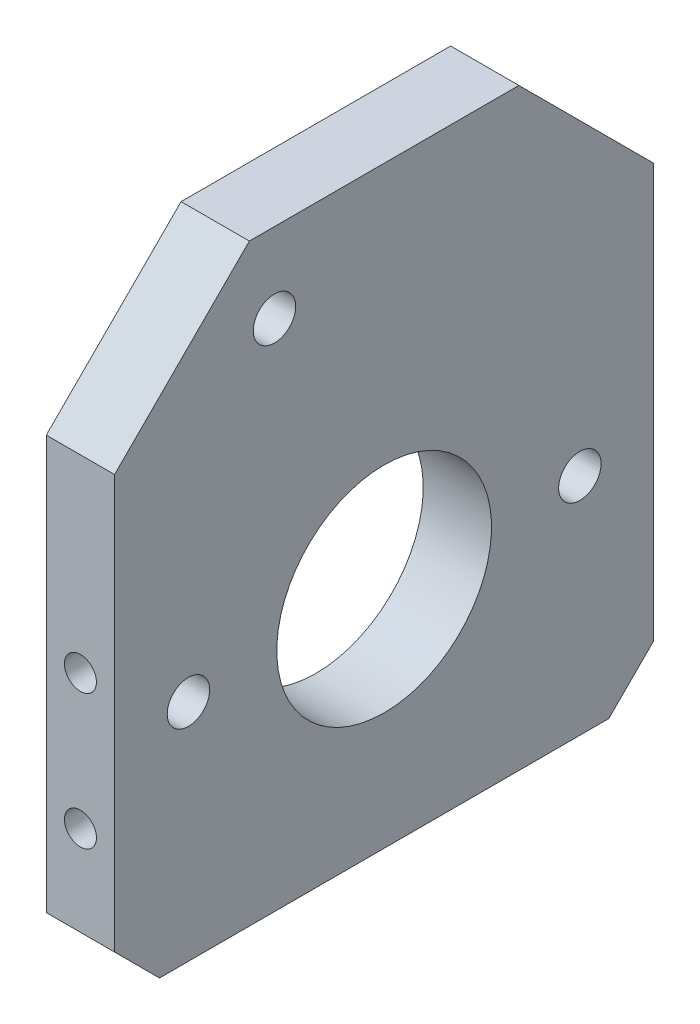
ISO-10303-21;
HEADER;
FILE_DESCRIPTION(('STEP AP214'),'2;1');
FILE_NAME('part.step','',(''),(''),'','','');
FILE_SCHEMA(('AUTOMOTIVE_DESIGN { 1 0 10303 214 1 1 1 1 }'));
ENDSEC;
DATA;
#1=APPLICATION_CONTEXT('core data for automotive mechanical design processes');
#2=APPLICATION_PROTOCOL_DEFINITION('international standard','automotive_design',2000,#1);
#3=PRODUCT_CONTEXT('',#1,'mechanical');
#4=PRODUCT('Part','Part','',(#3));
#5=PRODUCT_RELATED_PRODUCT_CATEGORY('part','',(#4));
#6=PRODUCT_DEFINITION_FORMATION('','',#4);
#7=PRODUCT_DEFINITION_CONTEXT('part definition',#1,'design');
#8=PRODUCT_DEFINITION('design','',#6,#7);
#9=PRODUCT_DEFINITION_SHAPE('','',#8);
#10=(LENGTH_UNIT() NAMED_UNIT(*) SI_UNIT(.MILLI.,.METRE.));
#11=(NAMED_UNIT(*) PLANE_ANGLE_UNIT() SI_UNIT($,.RADIAN.));
#12=(NAMED_UNIT(*) SI_UNIT($,.STERADIAN.) SOLID_ANGLE_UNIT());
#13=UNCERTAINTY_MEASURE_WITH_UNIT(LENGTH_MEASURE(1.E-05),#10,'distance_accuracy_value','');
#14=(GEOMETRIC_REPRESENTATION_CONTEXT(3) GLOBAL_UNCERTAINTY_ASSIGNED_CONTEXT((#13)) GLOBAL_UNIT_ASSIGNED_CONTEXT((#10,
#11,#12)) REPRESENTATION_CONTEXT('',''));
#15=CARTESIAN_POINT('',(0.,0.,0.));
#16=DIRECTION('',(0.,0.,1.));
#17=DIRECTION('',(1.,0.,0.));
#18=AXIS2_PLACEMENT_3D('',#15,#16,#17);
#19=CARTESIAN_POINT('',(4.826,0.,0.));
#20=DIRECTION('',(1.,0.,0.));
#21=DIRECTION('',(0.,1.,0.));
#22=AXIS2_PLACEMENT_3D('',#19,#20,#21);
#23=PLANE('',#22);
#24=CARTESIAN_POINT('',(4.82600000000078,24.6557401750094,3.49708995956852));
#25=DIRECTION('',(-1.,0.,0.));
#26=DIRECTION('',(0.,0.,1.));
#27=AXIS2_PLACEMENT_3D('',#24,#25,#26);
#28=CIRCLE('',#27,1.5);
#29=CARTESIAN_POINT('',(4.82600000000079,24.6557401750094,4.99708995956851));
#30=VERTEX_POINT('',#29);
#31=EDGE_CURVE('E191',#30,#30,#28,.T.);
#32=ORIENTED_EDGE('',*,*,#31,.T.);
#33=EDGE_LOOP('',(#32));
#34=FACE_BOUND('',#33,.T.);
#35=CARTESIAN_POINT('',(4.82600000000113,4.2323464163506,9.57640664550778));
#36=DIRECTION('',(-1.,0.,0.));
#37=DIRECTION('',(0.,0.,1.));
#38=AXIS2_PLACEMENT_3D('',#35,#36,#37);
#39=CIRCLE('',#38,1.5);
#40=CARTESIAN_POINT('',(4.82600000000114,4.2323464163506,11.0764066455078));
#41=VERTEX_POINT('',#40);
#42=EDGE_CURVE('E198',#41,#41,#39,.T.);
#43=ORIENTED_EDGE('',*,*,#42,.T.);
#44=EDGE_LOOP('',(#43));
#45=FACE_BOUND('',#44,.T.);
#46=CARTESIAN_POINT('',(4.82600000000084,4.2323464163506,-18.0822267263709));
#47=DIRECTION('',(-1.,0.,0.));
#48=DIRECTION('',(0.,0.,1.));
#49=AXIS2_PLACEMENT_3D('',#46,#47,#48);
#50=CIRCLE('',#49,1.5);
#51=CARTESIAN_POINT('',(4.82600000000085,4.2323464163506,-16.5822267263709));
#52=VERTEX_POINT('',#51);
#53=EDGE_CURVE('E206',#52,#52,#50,.T.);
#54=ORIENTED_EDGE('',*,*,#53,.T.);
#55=EDGE_LOOP('',(#54));
#56=FACE_BOUND('',#55,.T.);
#57=DIRECTION('',(0.,-1.,0.));
#58=VECTOR('',#57,1.);
#59=CARTESIAN_POINT('',(4.82599999999973,30.2823464163507,14.7970899595685));
#60=LINE('',#59,#58);
#61=CARTESIAN_POINT('',(4.82599999999986,20.7573464163507,14.7970899595685));
#62=VERTEX_POINT('',#61);
#63=CARTESIAN_POINT('',(4.82600000000027,-8.46765358364934,14.7970899595684));
#64=VERTEX_POINT('',#63);
#65=EDGE_CURVE('E219',#62,#64,#60,.T.);
#66=ORIENTED_EDGE('',*,*,#65,.T.);
#67=DIRECTION('',(0.,0.70710678118655,0.707106781186545));
#68=VECTOR('',#67,1.);
#69=CARTESIAN_POINT('',(4.82600000000028,-11.6323717716089,11.632371771609));
#70=LINE('',#69,#68);
#71=CARTESIAN_POINT('',(4.82600000000028,-11.6426535836494,11.6220899595684));
#72=VERTEX_POINT('',#71);
#73=EDGE_CURVE('E54',#64,#72,#70,.F.);
#74=ORIENTED_EDGE('',*,*,#73,.T.);
#75=DIRECTION('',(0.,0.,-1.));
#76=VECTOR('',#75,1.);
#77=CARTESIAN_POINT('',(4.82600000000032,-11.6426535836494,14.7970899595684));
#78=LINE('',#77,#76);
#79=CARTESIAN_POINT('',(4.82599999999995,-11.6426535836494,-20.1279100404315));
#80=VERTEX_POINT('',#79);
#81=EDGE_CURVE('E222',#72,#80,#78,.T.);
#82=ORIENTED_EDGE('',*,*,#81,.T.);
#83=DIRECTION('',(0.,-0.707106781186546,0.707106781186549));
#84=VECTOR('',#83,1.);
#85=CARTESIAN_POINT('',(4.82600000000005,-15.8852818120404,-15.8852818120405));
#86=LINE('',#85,#84);
#87=CARTESIAN_POINT('',(4.82599999999987,-8.46765358364935,-23.3029100404316));
#88=VERTEX_POINT('',#87);
#89=EDGE_CURVE('E64',#80,#88,#86,.F.);
#90=ORIENTED_EDGE('',*,*,#89,.T.);
#91=DIRECTION('',(0.,1.,0.));
#92=VECTOR('',#91,1.);
#93=CARTESIAN_POINT('',(4.82599999999933,30.2823464163507,-23.3029100404315));
#94=LINE('',#93,#92);
#95=CARTESIAN_POINT('',(4.82599999999946,20.7573464163506,-23.3029100404315));
#96=VERTEX_POINT('',#95);
#97=EDGE_CURVE('E225',#88,#96,#94,.T.);
#98=ORIENTED_EDGE('',*,*,#97,.T.);
#99=DIRECTION('',(0.,-0.707106781186549,-0.707106781186546));
#100=VECTOR('',#99,1.);
#101=CARTESIAN_POINT('',(4.82599999999946,22.0301282283911,-22.0301282283911));
#102=LINE('',#101,#100);
#103=CARTESIAN_POINT('',(4.82599999999943,30.2823464163507,-13.7779100404315));
#104=VERTEX_POINT('',#103);
#105=EDGE_CURVE('E265',#96,#104,#102,.F.);
#106=ORIENTED_EDGE('',*,*,#105,.T.);
#107=DIRECTION('',(0.,0.,1.));
#108=VECTOR('',#107,1.);
#109=CARTESIAN_POINT('',(4.82599999999973,30.2823464163507,14.7970899595685));
#110=LINE('',#109,#108);
#111=CARTESIAN_POINT('',(4.82599999999963,30.2823464163507,5.27208995956843));
#112=VERTEX_POINT('',#111);
#113=EDGE_CURVE('E228',#104,#112,#110,.T.);
#114=ORIENTED_EDGE('',*,*,#113,.T.);
#115=DIRECTION('',(0.,0.707106781186546,-0.707106781186549));
#116=VECTOR('',#115,1.);
#117=CARTESIAN_POINT('',(4.82599999999994,17.7772181879597,17.7772181879595));
#118=LINE('',#117,#116);
#119=EDGE_CURVE('E262',#112,#62,#118,.F.);
#120=ORIENTED_EDGE('',*,*,#119,.T.);
#121=EDGE_LOOP('',(#66,#74,#82,#90,#98,#106,#114,#120));
#122=FACE_BOUND('',#121,.T.);
#123=CARTESIAN_POINT('',(4.8259999999999,4.23234641635067,-4.25291004043155));
#124=DIRECTION('',(1.,0.,0.));
#125=DIRECTION('',(0.,1.,0.));
#126=AXIS2_PLACEMENT_3D('',#123,#124,#125);
#127=CIRCLE('',#126,7.5875);
#128=CARTESIAN_POINT('',(4.82599999999979,11.8198464163507,-4.25291004043155));
#129=VERTEX_POINT('',#128);
#130=EDGE_CURVE('E211',#129,#129,#127,.T.);
#131=ORIENTED_EDGE('',*,*,#130,.F.);
#132=EDGE_LOOP('',(#131));
#133=FACE_BOUND('',#132,.T.);
#134=ADVANCED_FACE('F45',(#34,#45,#56,#122,#133),#23,.T.);
#135=CARTESIAN_POINT('',(0.,0.,0.));
#136=DIRECTION('',(1.,0.,0.));
#137=DIRECTION('',(0.,1.,0.));
#138=AXIS2_PLACEMENT_3D('',#135,#136,#137);
#139=PLANE('',#138);
#140=CARTESIAN_POINT('',(-3.07587689183458E-13,24.6557401750094,3.49708995956857));
#141=DIRECTION('',(-1.,0.,0.));
#142=DIRECTION('',(0.,0.,1.));
#143=AXIS2_PLACEMENT_3D('',#140,#141,#142);
#144=CIRCLE('',#143,1.5);
#145=CARTESIAN_POINT('',(-2.91876023158664E-13,24.6557401750094,4.99708995956857));
#146=VERTEX_POINT('',#145);
#147=EDGE_CURVE('E187',#146,#146,#144,.T.);
#148=ORIENTED_EDGE('',*,*,#147,.F.);
#149=EDGE_LOOP('',(#148));
#150=FACE_BOUND('',#149,.T.);
#151=CARTESIAN_POINT('',(0.,4.2323464163506,9.57640664550783));
#152=DIRECTION('',(-1.,0.,0.));
#153=DIRECTION('',(0.,0.,1.));
#154=AXIS2_PLACEMENT_3D('',#151,#152,#153);
#155=CIRCLE('',#154,1.5);
#156=CARTESIAN_POINT('',(0.,4.2323464163506,11.0764066455078));
#157=VERTEX_POINT('',#156);
#158=EDGE_CURVE('E195',#157,#157,#155,.T.);
#159=ORIENTED_EDGE('',*,*,#158,.F.);
#160=EDGE_LOOP('',(#159));
#161=FACE_BOUND('',#160,.T.);
#162=CARTESIAN_POINT('',(-2.48387440988479E-13,4.2323464163506,-18.0822267263708));
#163=DIRECTION('',(-1.,0.,0.));
#164=DIRECTION('',(0.,0.,1.));
#165=AXIS2_PLACEMENT_3D('',#162,#163,#164);
#166=CIRCLE('',#165,1.5);
#167=CARTESIAN_POINT('',(-2.32675774963685E-13,4.2323464163506,-16.5822267263708));
#168=VERTEX_POINT('',#167);
#169=EDGE_CURVE('E202',#168,#168,#166,.T.);
#170=ORIENTED_EDGE('',*,*,#169,.F.);
#171=EDGE_LOOP('',(#170));
#172=FACE_BOUND('',#171,.T.);
#173=DIRECTION('',(0.,0.,-1.));
#174=VECTOR('',#173,1.);
#175=CARTESIAN_POINT('',(3.17591721276758E-13,-11.6426535836494,14.7970899595685));
#176=LINE('',#175,#174);
#177=CARTESIAN_POINT('',(2.84335361524277E-13,-11.6426535836494,11.6220899595685));
#178=VERTEX_POINT('',#177);
#179=CARTESIAN_POINT('',(0.,-11.6426535836494,-20.1279100404315));
#180=VERTEX_POINT('',#179);
#181=EDGE_CURVE('E235',#178,#180,#176,.T.);
#182=ORIENTED_EDGE('',*,*,#181,.F.);
#183=DIRECTION('',(0.,-0.70710678118655,-0.707106781186545));
#184=VECTOR('',#183,1.);
#185=CARTESIAN_POINT('',(2.83627288322208E-13,-11.6426535836494,11.6220899595685));
#186=LINE('',#185,#184);
#187=CARTESIAN_POINT('',(2.7324990827345E-13,-8.4676535836494,14.7970899595685));
#188=VERTEX_POINT('',#187);
#189=EDGE_CURVE('E282',#178,#188,#186,.F.);
#190=ORIENTED_EDGE('',*,*,#189,.T.);
#191=DIRECTION('',(0.,-1.,0.));
#192=VECTOR('',#191,1.);
#193=CARTESIAN_POINT('',(-2.67929699247236E-13,30.2823464163506,14.7970899595685));
#194=LINE('',#193,#192);
#195=CARTESIAN_POINT('',(-1.34904260237313E-13,20.7573464163506,14.7970899595685));
#196=VERTEX_POINT('',#195);
#197=EDGE_CURVE('E215',#196,#188,#194,.T.);
#198=ORIENTED_EDGE('',*,*,#197,.F.);
#199=DIRECTION('',(0.,-0.707106781186546,0.707106781186549));
#200=VECTOR('',#199,1.);
#201=CARTESIAN_POINT('',(-1.34441069388203E-13,20.7573464163506,14.7970899595685));
#202=LINE('',#201,#200);
#203=CARTESIAN_POINT('',(-3.67698778504679E-13,30.2823464163506,5.27208995956848));
#204=VERTEX_POINT('',#203);
#205=EDGE_CURVE('E251',#196,#204,#202,.F.);
#206=ORIENTED_EDGE('',*,*,#205,.T.);
#207=DIRECTION('',(0.,0.,1.));
#208=VECTOR('',#207,1.);
#209=CARTESIAN_POINT('',(-2.67929699247236E-13,30.2823464163506,14.7970899595685));
#210=LINE('',#209,#208);
#211=CARTESIAN_POINT('',(-5.67236937019564E-13,30.2823464163506,-13.7779100404315));
#212=VERTEX_POINT('',#211);
#213=EDGE_CURVE('E223',#212,#204,#210,.T.);
#214=ORIENTED_EDGE('',*,*,#213,.F.);
#215=DIRECTION('',(0.,0.707106781186549,0.707106781186546));
#216=VECTOR('',#215,1.);
#217=CARTESIAN_POINT('',(-5.67254576644416E-13,30.2823464163506,-13.7779100404315));
#218=LINE('',#217,#216);
#219=CARTESIAN_POINT('',(-5.33980577267082E-13,20.7573464163506,-23.3029100404315));
#220=VERTEX_POINT('',#219);
#221=EDGE_CURVE('E254',#212,#220,#218,.F.);
#222=ORIENTED_EDGE('',*,*,#221,.T.);
#223=DIRECTION('',(0.,1.,0.));
#224=VECTOR('',#223,1.);
#225=CARTESIAN_POINT('',(-6.67006016277006E-13,30.2823464163506,-23.3029100404315));
#226=LINE('',#225,#224);
#227=CARTESIAN_POINT('',(-1.2582640875632E-13,-8.46765358364942,-23.3029100404315));
#228=VERTEX_POINT('',#227);
#229=EDGE_CURVE('E239',#228,#220,#226,.T.);
#230=ORIENTED_EDGE('',*,*,#229,.F.);
#231=DIRECTION('',(0.,0.707106781186546,-0.707106781186549));
#232=VECTOR('',#231,1.);
#233=CARTESIAN_POINT('',(-1.25767452008319E-13,-8.46765358364942,-23.3029100404315));
#234=LINE('',#233,#232);
#235=EDGE_CURVE('E279',#228,#180,#234,.F.);
#236=ORIENTED_EDGE('',*,*,#235,.T.);
#237=EDGE_LOOP('',(#182,#190,#198,#206,#214,#222,#230,#236));
#238=FACE_BOUND('',#237,.T.);
#239=CARTESIAN_POINT('',(-1.03655502254666E-13,4.2323464163506,-4.2529100404315));
#240=DIRECTION('',(1.,0.,0.));
#241=DIRECTION('',(0.,1.,0.));
#242=AXIS2_PLACEMENT_3D('',#239,#240,#241);
#243=CIRCLE('',#242,7.5875);
#244=CARTESIAN_POINT('',(-2.09621960888556E-13,11.8198464163506,-4.2529100404315));
#245=VERTEX_POINT('',#244);
#246=EDGE_CURVE('E210',#245,#245,#243,.T.);
#247=ORIENTED_EDGE('',*,*,#246,.T.);
#248=EDGE_LOOP('',(#247));
#249=FACE_BOUND('',#248,.T.);
#250=ADVANCED_FACE('F301',(#150,#161,#172,#238,#249),#139,.F.);
#251=CARTESIAN_POINT('',(4.82599999999973,30.2823464163507,14.7970899595685));
#252=DIRECTION('',(0.,0.,-1.));
#253=DIRECTION('',(-1.,0.,0.));
#254=AXIS2_PLACEMENT_3D('',#251,#252,#253);
#255=PLANE('',#254);
#256=CARTESIAN_POINT('',(2.41299999999956,-2.1176535836495,14.7970899595685));
#257=DIRECTION('',(0.,0.,1.));
#258=DIRECTION('',(1.,0.,0.));
#259=AXIS2_PLACEMENT_3D('',#256,#257,#258);
#260=CIRCLE('',#259,1.1303);
#261=CARTESIAN_POINT('',(3.54329999999956,-2.1176535836495,14.7970899595685));
#262=VERTEX_POINT('',#261);
#263=EDGE_CURVE('E156',#262,#262,#260,.T.);
#264=ORIENTED_EDGE('',*,*,#263,.F.);
#265=EDGE_LOOP('',(#264));
#266=FACE_BOUND('',#265,.T.);
#267=CARTESIAN_POINT('',(2.41300000000005,7.4073464163505,14.7970899595685));
#268=DIRECTION('',(0.,0.,1.));
#269=DIRECTION('',(1.,0.,0.));
#270=AXIS2_PLACEMENT_3D('',#267,#268,#269);
#271=CIRCLE('',#270,1.1303);
#272=CARTESIAN_POINT('',(3.54330000000005,7.4073464163505,14.7970899595685));
#273=VERTEX_POINT('',#272);
#274=EDGE_CURVE('E155',#273,#273,#271,.T.);
#275=ORIENTED_EDGE('',*,*,#274,.F.);
#276=EDGE_LOOP('',(#275));
#277=FACE_BOUND('',#276,.T.);
#278=ORIENTED_EDGE('',*,*,#197,.T.);
#279=DIRECTION('',(1.,0.,0.));
#280=VECTOR('',#279,1.);
#281=CARTESIAN_POINT('',(4.82600000000027,-8.46765358364934,14.7970899595684));
#282=LINE('',#281,#280);
#283=EDGE_CURVE('E75',#188,#64,#282,.T.);
#284=ORIENTED_EDGE('',*,*,#283,.T.);
#285=ORIENTED_EDGE('',*,*,#65,.F.);
#286=DIRECTION('',(-1.,0.,0.));
#287=VECTOR('',#286,1.);
#288=CARTESIAN_POINT('',(4.82599999999986,20.7573464163507,14.7970899595685));
#289=LINE('',#288,#287);
#290=EDGE_CURVE('E268',#62,#196,#289,.T.);
#291=ORIENTED_EDGE('',*,*,#290,.T.);
#292=EDGE_LOOP('',(#278,#284,#285,#291));
#293=FACE_BOUND('',#292,.T.);
#294=ADVANCED_FACE('F303',(#266,#277,#293),#255,.F.);
#295=CARTESIAN_POINT('',(4.82600000000032,-11.6426535836494,14.7970899595684));
#296=DIRECTION('',(0.,1.,0.));
#297=DIRECTION('',(-1.,0.,0.));
#298=AXIS2_PLACEMENT_3D('',#295,#296,#297);
#299=PLANE('',#298);
#300=ORIENTED_EDGE('',*,*,#81,.F.);
#301=DIRECTION('',(-1.,0.,0.));
#302=VECTOR('',#301,1.);
#303=CARTESIAN_POINT('',(4.82600000000028,-11.6426535836494,11.6220899595684));
#304=LINE('',#303,#302);
#305=EDGE_CURVE('E275',#72,#178,#304,.T.);
#306=ORIENTED_EDGE('',*,*,#305,.T.);
#307=ORIENTED_EDGE('',*,*,#181,.T.);
#308=DIRECTION('',(1.,0.,0.));
#309=VECTOR('',#308,1.);
#310=CARTESIAN_POINT('',(4.82599999999995,-11.6426535836494,-20.1279100404315));
#311=LINE('',#310,#309);
#312=EDGE_CURVE('E272',#180,#80,#311,.T.);
#313=ORIENTED_EDGE('',*,*,#312,.T.);
#314=EDGE_LOOP('',(#300,#306,#307,#313));
#315=FACE_BOUND('',#314,.T.);
#316=ADVANCED_FACE('F295',(#315),#299,.F.);
#317=CARTESIAN_POINT('',(4.82599999999933,30.2823464163507,-23.3029100404315));
#318=DIRECTION('',(0.,0.,1.));
#319=DIRECTION('',(1.,0.,0.));
#320=AXIS2_PLACEMENT_3D('',#317,#318,#319);
#321=PLANE('',#320);
#322=CARTESIAN_POINT('',(2.41299999999947,7.4073464163505,-23.3029100404315));
#323=DIRECTION('',(0.,0.,-1.));
#324=DIRECTION('',(0.,1.,0.));
#325=AXIS2_PLACEMENT_3D('',#322,#323,#324);
#326=CIRCLE('',#325,1.1303);
#327=CARTESIAN_POINT('',(2.41299999999947,8.5376464163505,-23.3029100404315));
#328=VERTEX_POINT('',#327);
#329=EDGE_CURVE('E171',#328,#328,#326,.T.);
#330=ORIENTED_EDGE('',*,*,#329,.F.);
#331=EDGE_LOOP('',(#330));
#332=FACE_BOUND('',#331,.T.);
#333=CARTESIAN_POINT('',(2.41299999999947,-2.11765358364949,-23.3029100404315));
#334=DIRECTION('',(0.,0.,-1.));
#335=DIRECTION('',(0.,1.,0.));
#336=AXIS2_PLACEMENT_3D('',#333,#334,#335);
#337=CIRCLE('',#336,1.1303);
#338=CARTESIAN_POINT('',(2.41299999999947,-0.987353583649495,-23.3029100404315));
#339=VERTEX_POINT('',#338);
#340=EDGE_CURVE('E179',#339,#339,#337,.T.);
#341=ORIENTED_EDGE('',*,*,#340,.F.);
#342=EDGE_LOOP('',(#341));
#343=FACE_BOUND('',#342,.T.);
#344=ORIENTED_EDGE('',*,*,#97,.F.);
#345=DIRECTION('',(-1.,0.,0.));
#346=VECTOR('',#345,1.);
#347=CARTESIAN_POINT('',(4.82599999999987,-8.46765358364935,-23.3029100404316));
#348=LINE('',#347,#346);
#349=EDGE_CURVE('E11',#88,#228,#348,.T.);
#350=ORIENTED_EDGE('',*,*,#349,.T.);
#351=ORIENTED_EDGE('',*,*,#229,.T.);
#352=DIRECTION('',(1.,0.,0.));
#353=VECTOR('',#352,1.);
#354=CARTESIAN_POINT('',(4.82599999999946,20.7573464163506,-23.3029100404315));
#355=LINE('',#354,#353);
#356=EDGE_CURVE('E258',#220,#96,#355,.T.);
#357=ORIENTED_EDGE('',*,*,#356,.T.);
#358=EDGE_LOOP('',(#344,#350,#351,#357));
#359=FACE_BOUND('',#358,.T.);
#360=ADVANCED_FACE('F320',(#332,#343,#359),#321,.F.);
#361=CARTESIAN_POINT('',(4.82599999999973,30.2823464163507,14.7970899595685));
#362=DIRECTION('',(0.,-1.,0.));
#363=DIRECTION('',(1.,0.,0.));
#364=AXIS2_PLACEMENT_3D('',#361,#362,#363);
#365=PLANE('',#364);
#366=ORIENTED_EDGE('',*,*,#113,.F.);
#367=DIRECTION('',(-1.,0.,0.));
#368=VECTOR('',#367,1.);
#369=CARTESIAN_POINT('',(4.82599999999943,30.2823464163507,-13.7779100404316));
#370=LINE('',#369,#368);
#371=EDGE_CURVE('E247',#104,#212,#370,.T.);
#372=ORIENTED_EDGE('',*,*,#371,.T.);
#373=ORIENTED_EDGE('',*,*,#213,.T.);
#374=DIRECTION('',(1.,0.,0.));
#375=VECTOR('',#374,1.);
#376=CARTESIAN_POINT('',(4.82599999999963,30.2823464163507,5.27208995956843));
#377=LINE('',#376,#375);
#378=EDGE_CURVE('E232',#204,#112,#377,.T.);
#379=ORIENTED_EDGE('',*,*,#378,.T.);
#380=EDGE_LOOP('',(#366,#372,#373,#379));
#381=FACE_BOUND('',#380,.T.);
#382=ADVANCED_FACE('F312',(#381),#365,.F.);
#383=CARTESIAN_POINT('',(4.8259999999999,4.23234641635067,-4.25291004043155));
#384=DIRECTION('',(-1.,0.,0.));
#385=DIRECTION('',(0.,-1.,0.));
#386=AXIS2_PLACEMENT_3D('',#383,#384,#385);
#387=CYLINDRICAL_SURFACE('',#386,7.5875);
#388=ORIENTED_EDGE('',*,*,#130,.T.);
#389=EDGE_LOOP('',(#388));
#390=FACE_BOUND('',#389,.T.);
#391=ORIENTED_EDGE('',*,*,#246,.F.);
#392=EDGE_LOOP('',(#391));
#393=FACE_BOUND('',#392,.T.);
#394=ADVANCED_FACE('F343',(#390,#393),#387,.F.);
#395=CARTESIAN_POINT('',(-2.48509905668394E-13,4.2323464163506,-18.0822267263708));
#396=DIRECTION('',(-1.,0.,0.));
#397=DIRECTION('',(0.,0.,1.));
#398=AXIS2_PLACEMENT_3D('',#395,#396,#397);
#399=CYLINDRICAL_SURFACE('',#398,1.5);
#400=ORIENTED_EDGE('',*,*,#53,.F.);
#401=EDGE_LOOP('',(#400));
#402=FACE_BOUND('',#401,.T.);
#403=ORIENTED_EDGE('',*,*,#169,.T.);
#404=EDGE_LOOP('',(#403));
#405=FACE_BOUND('',#404,.T.);
#406=ADVANCED_FACE('F397',(#402,#405),#399,.F.);
#407=CARTESIAN_POINT('',(0.,4.2323464163506,9.57640664550783));
#408=DIRECTION('',(-1.,0.,0.));
#409=DIRECTION('',(0.,0.,1.));
#410=AXIS2_PLACEMENT_3D('',#407,#408,#409);
#411=CYLINDRICAL_SURFACE('',#410,1.5);
#412=ORIENTED_EDGE('',*,*,#42,.F.);
#413=EDGE_LOOP('',(#412));
#414=FACE_BOUND('',#413,.T.);
#415=ORIENTED_EDGE('',*,*,#158,.T.);
#416=EDGE_LOOP('',(#415));
#417=FACE_BOUND('',#416,.T.);
#418=ADVANCED_FACE('F384',(#414,#417),#411,.F.);
#419=CARTESIAN_POINT('',(-3.07710153863372E-13,24.6557401750094,3.49708995956857));
#420=DIRECTION('',(-1.,0.,0.));
#421=DIRECTION('',(0.,0.,1.));
#422=AXIS2_PLACEMENT_3D('',#419,#420,#421);
#423=CYLINDRICAL_SURFACE('',#422,1.5);
#424=ORIENTED_EDGE('',*,*,#31,.F.);
#425=EDGE_LOOP('',(#424));
#426=FACE_BOUND('',#425,.T.);
#427=ORIENTED_EDGE('',*,*,#147,.T.);
#428=EDGE_LOOP('',(#427));
#429=FACE_BOUND('',#428,.T.);
#430=ADVANCED_FACE('F358',(#426,#429),#423,.F.);
#431=CARTESIAN_POINT('',(4.82599999999943,30.2823464163507,-13.7779100404315));
#432=DIRECTION('',(0.,-0.707106781186546,0.707106781186549));
#433=DIRECTION('',(-1.,0.,0.));
#434=AXIS2_PLACEMENT_3D('',#431,#432,#433);
#435=PLANE('',#434);
#436=ORIENTED_EDGE('',*,*,#105,.F.);
#437=ORIENTED_EDGE('',*,*,#356,.F.);
#438=ORIENTED_EDGE('',*,*,#221,.F.);
#439=ORIENTED_EDGE('',*,*,#371,.F.);
#440=EDGE_LOOP('',(#436,#437,#438,#439));
#441=FACE_BOUND('',#440,.T.);
#442=ADVANCED_FACE('F316',(#441),#435,.F.);
#443=CARTESIAN_POINT('',(4.82599999999986,20.7573464163507,14.7970899595685));
#444=DIRECTION('',(0.,-0.707106781186549,-0.707106781186546));
#445=DIRECTION('',(-1.,0.,0.));
#446=AXIS2_PLACEMENT_3D('',#443,#444,#445);
#447=PLANE('',#446);
#448=ORIENTED_EDGE('',*,*,#119,.F.);
#449=ORIENTED_EDGE('',*,*,#378,.F.);
#450=ORIENTED_EDGE('',*,*,#205,.F.);
#451=ORIENTED_EDGE('',*,*,#290,.F.);
#452=EDGE_LOOP('',(#448,#449,#450,#451));
#453=FACE_BOUND('',#452,.T.);
#454=ADVANCED_FACE('F307',(#453),#447,.F.);
#455=CARTESIAN_POINT('',(4.82600000000028,-11.6426535836494,11.6220899595684));
#456=DIRECTION('',(0.,0.707106781186545,-0.70710678118655));
#457=DIRECTION('',(-1.,0.,0.));
#458=AXIS2_PLACEMENT_3D('',#455,#456,#457);
#459=PLANE('',#458);
#460=ORIENTED_EDGE('',*,*,#73,.F.);
#461=ORIENTED_EDGE('',*,*,#283,.F.);
#462=ORIENTED_EDGE('',*,*,#189,.F.);
#463=ORIENTED_EDGE('',*,*,#305,.F.);
#464=EDGE_LOOP('',(#460,#461,#462,#463));
#465=FACE_BOUND('',#464,.T.);
#466=ADVANCED_FACE('F298',(#465),#459,.F.);
#467=CARTESIAN_POINT('',(4.82599999999987,-8.46765358364935,-23.3029100404316));
#468=DIRECTION('',(0.,0.707106781186549,0.707106781186546));
#469=DIRECTION('',(-1.,0.,0.));
#470=AXIS2_PLACEMENT_3D('',#467,#468,#469);
#471=PLANE('',#470);
#472=ORIENTED_EDGE('',*,*,#89,.F.);
#473=ORIENTED_EDGE('',*,*,#312,.F.);
#474=ORIENTED_EDGE('',*,*,#235,.F.);
#475=ORIENTED_EDGE('',*,*,#349,.F.);
#476=EDGE_LOOP('',(#472,#473,#474,#475));
#477=FACE_BOUND('',#476,.T.);
#478=ADVANCED_FACE('F47',(#477),#471,.F.);
#479=CARTESIAN_POINT('',(2.41299999999947,-2.1176535836495,-15.6829100404315));
#480=DIRECTION('',(0.,0.,-1.));
#481=DIRECTION('',(0.,1.,0.));
#482=AXIS2_PLACEMENT_3D('',#479,#480,#481);
#483=CONICAL_SURFACE('',#482,1.1303,1.02974425867665);
#484=CARTESIAN_POINT('',(2.41299999999947,-2.1176535836495,-15.0037572827447));
#485=VERTEX_POINT('',#484);
#486=VERTEX_LOOP('',#485);
#487=FACE_BOUND('',#486,.T.);
#488=CARTESIAN_POINT('',(2.41299999999947,-2.1176535836495,-15.6829100404315));
#489=DIRECTION('',(0.,0.,-1.));
#490=DIRECTION('',(0.,1.,0.));
#491=AXIS2_PLACEMENT_3D('',#488,#489,#490);
#492=CIRCLE('',#491,1.1303);
#493=CARTESIAN_POINT('',(2.41299999999947,-0.987353583649498,-15.6829100404315));
#494=VERTEX_POINT('',#493);
#495=EDGE_CURVE('E183',#494,#494,#492,.T.);
#496=ORIENTED_EDGE('',*,*,#495,.T.);
#497=EDGE_LOOP('',(#496));
#498=FACE_BOUND('',#497,.T.);
#499=ADVANCED_FACE('F324',(#487,#498),#483,.F.);
#500=CARTESIAN_POINT('',(2.41299999999947,-2.11765358364949,-23.3029100404315));
#501=DIRECTION('',(0.,0.,-1.));
#502=DIRECTION('',(0.,1.,0.));
#503=AXIS2_PLACEMENT_3D('',#500,#501,#502);
#504=CYLINDRICAL_SURFACE('',#503,1.1303);
#505=ORIENTED_EDGE('',*,*,#495,.F.);
#506=EDGE_LOOP('',(#505));
#507=FACE_BOUND('',#506,.T.);
#508=ORIENTED_EDGE('',*,*,#340,.T.);
#509=EDGE_LOOP('',(#508));
#510=FACE_BOUND('',#509,.T.);
#511=ADVANCED_FACE('F329',(#507,#510),#504,.F.);
#512=CARTESIAN_POINT('',(2.41299999999947,7.4073464163505,-15.6829100404315));
#513=DIRECTION('',(0.,0.,-1.));
#514=DIRECTION('',(0.,1.,0.));
#515=AXIS2_PLACEMENT_3D('',#512,#513,#514);
#516=CONICAL_SURFACE('',#515,1.1303,1.02974425867665);
#517=CARTESIAN_POINT('',(2.41299999999947,7.4073464163505,-15.0037572827447));
#518=VERTEX_POINT('',#517);
#519=VERTEX_LOOP('',#518);
#520=FACE_BOUND('',#519,.T.);
#521=CARTESIAN_POINT('',(2.41299999999947,7.4073464163505,-15.6829100404315));
#522=DIRECTION('',(0.,0.,-1.));
#523=DIRECTION('',(0.,1.,0.));
#524=AXIS2_PLACEMENT_3D('',#521,#522,#523);
#525=CIRCLE('',#524,1.1303);
#526=CARTESIAN_POINT('',(2.41299999999947,8.5376464163505,-15.6829100404315));
#527=VERTEX_POINT('',#526);
#528=EDGE_CURVE('E175',#527,#527,#525,.T.);
#529=ORIENTED_EDGE('',*,*,#528,.T.);
#530=EDGE_LOOP('',(#529));
#531=FACE_BOUND('',#530,.T.);
#532=ADVANCED_FACE('F492',(#520,#531),#516,.F.);
#533=CARTESIAN_POINT('',(2.41299999999947,7.4073464163505,-23.3029100404315));
#534=DIRECTION('',(0.,0.,-1.));
#535=DIRECTION('',(0.,1.,0.));
#536=AXIS2_PLACEMENT_3D('',#533,#534,#535);
#537=CYLINDRICAL_SURFACE('',#536,1.1303);
#538=ORIENTED_EDGE('',*,*,#528,.F.);
#539=EDGE_LOOP('',(#538));
#540=FACE_BOUND('',#539,.T.);
#541=ORIENTED_EDGE('',*,*,#329,.T.);
#542=EDGE_LOOP('',(#541));
#543=FACE_BOUND('',#542,.T.);
#544=ADVANCED_FACE('F451',(#540,#543),#537,.F.);
#545=CARTESIAN_POINT('',(2.41300000000005,7.4073464163505,7.17708995956848));
#546=DIRECTION('',(0.,0.,1.));
#547=DIRECTION('',(1.,0.,0.));
#548=AXIS2_PLACEMENT_3D('',#545,#546,#547);
#549=CONICAL_SURFACE('',#548,1.1303,1.02974425867665);
#550=CARTESIAN_POINT('',(2.41300000000005,7.4073464163505,6.49793720188163));
#551=VERTEX_POINT('',#550);
#552=VERTEX_LOOP('',#551);
#553=FACE_BOUND('',#552,.T.);
#554=CARTESIAN_POINT('',(2.41300000000005,7.4073464163505,7.17708995956848));
#555=DIRECTION('',(0.,0.,1.));
#556=DIRECTION('',(1.,0.,0.));
#557=AXIS2_PLACEMENT_3D('',#554,#555,#556);
#558=CIRCLE('',#557,1.1303);
#559=CARTESIAN_POINT('',(3.54330000000005,7.4073464163505,7.17708995956848));
#560=VERTEX_POINT('',#559);
#561=EDGE_CURVE('E162',#560,#560,#558,.T.);
#562=ORIENTED_EDGE('',*,*,#561,.T.);
#563=EDGE_LOOP('',(#562));
#564=FACE_BOUND('',#563,.T.);
#565=ADVANCED_FACE('F456',(#553,#564),#549,.F.);
#566=CARTESIAN_POINT('',(2.41300000000005,7.4073464163505,14.7970899595685));
#567=DIRECTION('',(0.,0.,1.));
#568=DIRECTION('',(1.,0.,0.));
#569=AXIS2_PLACEMENT_3D('',#566,#567,#568);
#570=CYLINDRICAL_SURFACE('',#569,1.1303);
#571=ORIENTED_EDGE('',*,*,#561,.F.);
#572=EDGE_LOOP('',(#571));
#573=FACE_BOUND('',#572,.T.);
#574=ORIENTED_EDGE('',*,*,#274,.T.);
#575=EDGE_LOOP('',(#574));
#576=FACE_BOUND('',#575,.T.);
#577=ADVANCED_FACE('F148',(#573,#576),#570,.F.);
#578=CARTESIAN_POINT('',(2.41299999999956,-2.1176535836495,7.17708995956848));
#579=DIRECTION('',(0.,0.,1.));
#580=DIRECTION('',(1.,0.,0.));
#581=AXIS2_PLACEMENT_3D('',#578,#579,#580);
#582=CONICAL_SURFACE('',#581,1.1303,1.02974425867665);
#583=CARTESIAN_POINT('',(2.41299999999956,-2.1176535836495,6.49793720188163));
#584=VERTEX_POINT('',#583);
#585=VERTEX_LOOP('',#584);
#586=FACE_BOUND('',#585,.T.);
#587=CARTESIAN_POINT('',(2.41299999999956,-2.1176535836495,7.17708995956848));
#588=DIRECTION('',(0.,0.,1.));
#589=DIRECTION('',(1.,0.,0.));
#590=AXIS2_PLACEMENT_3D('',#587,#588,#589);
#591=CIRCLE('',#590,1.1303);
#592=CARTESIAN_POINT('',(3.54329999999956,-2.1176535836495,7.17708995956848));
#593=VERTEX_POINT('',#592);
#594=EDGE_CURVE('E152',#593,#593,#591,.T.);
#595=ORIENTED_EDGE('',*,*,#594,.T.);
#596=EDGE_LOOP('',(#595));
#597=FACE_BOUND('',#596,.T.);
#598=ADVANCED_FACE('F144',(#586,#597),#582,.F.);
#599=CARTESIAN_POINT('',(2.41299999999956,-2.1176535836495,14.7970899595685));
#600=DIRECTION('',(0.,0.,1.));
#601=DIRECTION('',(1.,0.,0.));
#602=AXIS2_PLACEMENT_3D('',#599,#600,#601);
#603=CYLINDRICAL_SURFACE('',#602,1.1303);
#604=ORIENTED_EDGE('',*,*,#594,.F.);
#605=EDGE_LOOP('',(#604));
#606=FACE_BOUND('',#605,.T.);
#607=ORIENTED_EDGE('',*,*,#263,.T.);
#608=EDGE_LOOP('',(#607));
#609=FACE_BOUND('',#608,.T.);
#610=ADVANCED_FACE('F147',(#606,#609),#603,.F.);
#611=CLOSED_SHELL('',(#134,#250,#294,#316,#360,#382,#394,#406,#418,#430,#442,#454,#466,#478,
#499,#511,#532,#544,#565,#577,#598,#610));
#612=MANIFOLD_SOLID_BREP('B2',#611);
#613=ADVANCED_BREP_SHAPE_REPRESENTATION('',(#18,#612),#14);
#614=SHAPE_DEFINITION_REPRESENTATION(#9,#613);
ENDSEC;
END-ISO-10303-21;
